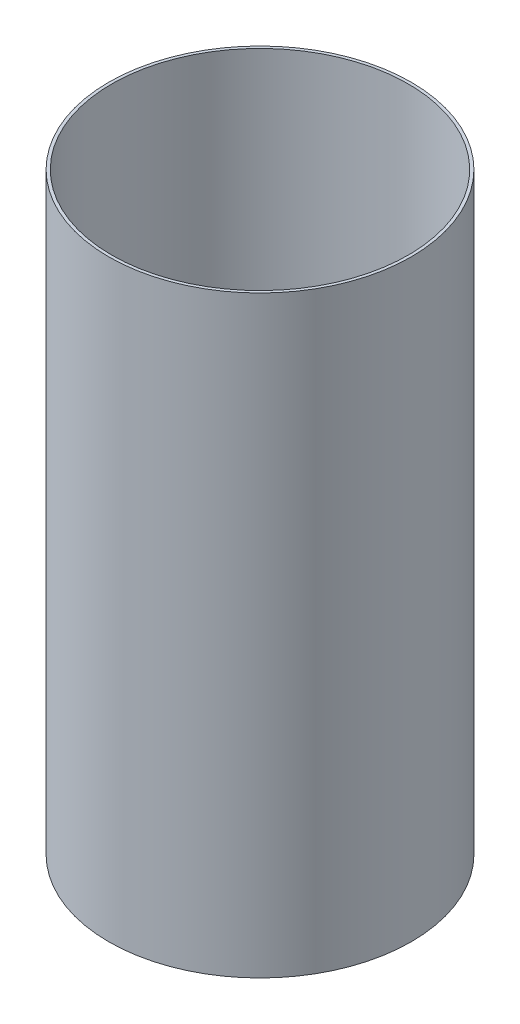
ISO-10303-21;
HEADER;
FILE_DESCRIPTION(('STEP AP214'),'2;1');
FILE_NAME('part.step','',(''),(''),'','','');
FILE_SCHEMA(('AUTOMOTIVE_DESIGN { 1 0 10303 214 1 1 1 1 }'));
ENDSEC;
DATA;
#1=APPLICATION_CONTEXT('core data for automotive mechanical design processes');
#2=APPLICATION_PROTOCOL_DEFINITION('international standard','automotive_design',2000,#1);
#3=PRODUCT_CONTEXT('',#1,'mechanical');
#4=PRODUCT('Part','Part','',(#3));
#5=PRODUCT_RELATED_PRODUCT_CATEGORY('part','',(#4));
#6=PRODUCT_DEFINITION_FORMATION('','',#4);
#7=PRODUCT_DEFINITION_CONTEXT('part definition',#1,'design');
#8=PRODUCT_DEFINITION('design','',#6,#7);
#9=PRODUCT_DEFINITION_SHAPE('','',#8);
#10=(LENGTH_UNIT() NAMED_UNIT(*) SI_UNIT(.MILLI.,.METRE.));
#11=(NAMED_UNIT(*) PLANE_ANGLE_UNIT() SI_UNIT($,.RADIAN.));
#12=(NAMED_UNIT(*) SI_UNIT($,.STERADIAN.) SOLID_ANGLE_UNIT());
#13=UNCERTAINTY_MEASURE_WITH_UNIT(LENGTH_MEASURE(1.E-05),#10,'distance_accuracy_value','');
#14=(GEOMETRIC_REPRESENTATION_CONTEXT(3) GLOBAL_UNCERTAINTY_ASSIGNED_CONTEXT((#13)) GLOBAL_UNIT_ASSIGNED_CONTEXT((#10,
#11,#12)) REPRESENTATION_CONTEXT('',''));
#15=CARTESIAN_POINT('',(0.,0.,0.));
#16=DIRECTION('',(0.,0.,1.));
#17=DIRECTION('',(1.,0.,0.));
#18=AXIS2_PLACEMENT_3D('',#15,#16,#17);
#19=CARTESIAN_POINT('',(0.,200.,0.));
#20=DIRECTION('',(0.,1.,0.));
#21=DIRECTION('',(0.,0.,1.));
#22=AXIS2_PLACEMENT_3D('',#19,#20,#21);
#23=PLANE('',#22);
#24=CARTESIAN_POINT('',(0.,200.,0.));
#25=DIRECTION('',(0.,1.,0.));
#26=DIRECTION('',(0.,0.,1.));
#27=AXIS2_PLACEMENT_3D('',#24,#25,#26);
#28=CIRCLE('',#27,51.);
#29=CARTESIAN_POINT('',(0.,200.,51.));
#30=VERTEX_POINT('',#29);
#31=EDGE_CURVE('E10',#30,#30,#28,.T.);
#32=ORIENTED_EDGE('',*,*,#31,.T.);
#33=EDGE_LOOP('',(#32));
#34=FACE_BOUND('',#33,.T.);
#35=CARTESIAN_POINT('',(0.,200.,0.));
#36=DIRECTION('',(0.,1.,0.));
#37=DIRECTION('',(0.,0.,1.));
#38=AXIS2_PLACEMENT_3D('',#35,#36,#37);
#39=CIRCLE('',#38,50.);
#40=CARTESIAN_POINT('',(0.,200.,50.));
#41=VERTEX_POINT('',#40);
#42=EDGE_CURVE('E54',#41,#41,#39,.T.);
#43=ORIENTED_EDGE('',*,*,#42,.F.);
#44=EDGE_LOOP('',(#43));
#45=FACE_BOUND('',#44,.T.);
#46=ADVANCED_FACE('F41',(#34,#45),#23,.T.);
#47=CARTESIAN_POINT('',(0.,0.,0.));
#48=DIRECTION('',(0.,1.,0.));
#49=DIRECTION('',(0.,0.,1.));
#50=AXIS2_PLACEMENT_3D('',#47,#48,#49);
#51=PLANE('',#50);
#52=CARTESIAN_POINT('',(0.,0.,0.));
#53=DIRECTION('',(0.,1.,0.));
#54=DIRECTION('',(0.,0.,1.));
#55=AXIS2_PLACEMENT_3D('',#52,#53,#54);
#56=CIRCLE('',#55,51.);
#57=CARTESIAN_POINT('',(0.,0.,51.));
#58=VERTEX_POINT('',#57);
#59=EDGE_CURVE('E45',#58,#58,#56,.T.);
#60=ORIENTED_EDGE('',*,*,#59,.F.);
#61=EDGE_LOOP('',(#60));
#62=FACE_BOUND('',#61,.T.);
#63=CARTESIAN_POINT('',(0.,0.,0.));
#64=DIRECTION('',(0.,1.,0.));
#65=DIRECTION('',(0.,0.,1.));
#66=AXIS2_PLACEMENT_3D('',#63,#64,#65);
#67=CIRCLE('',#66,50.);
#68=CARTESIAN_POINT('',(0.,0.,50.));
#69=VERTEX_POINT('',#68);
#70=EDGE_CURVE('E56',#69,#69,#67,.T.);
#71=ORIENTED_EDGE('',*,*,#70,.T.);
#72=EDGE_LOOP('',(#71));
#73=FACE_BOUND('',#72,.T.);
#74=ADVANCED_FACE('F68',(#62,#73),#51,.F.);
#75=CARTESIAN_POINT('',(0.,200.,0.));
#76=DIRECTION('',(0.,-1.,0.));
#77=DIRECTION('',(0.,0.,-1.));
#78=AXIS2_PLACEMENT_3D('',#75,#76,#77);
#79=CYLINDRICAL_SURFACE('',#78,51.);
#80=ORIENTED_EDGE('',*,*,#31,.F.);
#81=EDGE_LOOP('',(#80));
#82=FACE_BOUND('',#81,.T.);
#83=ORIENTED_EDGE('',*,*,#59,.T.);
#84=EDGE_LOOP('',(#83));
#85=FACE_BOUND('',#84,.T.);
#86=ADVANCED_FACE('F43',(#82,#85),#79,.T.);
#87=CARTESIAN_POINT('',(0.,200.,0.));
#88=DIRECTION('',(0.,-1.,0.));
#89=DIRECTION('',(0.,0.,-1.));
#90=AXIS2_PLACEMENT_3D('',#87,#88,#89);
#91=CYLINDRICAL_SURFACE('',#90,50.);
#92=ORIENTED_EDGE('',*,*,#42,.T.);
#93=EDGE_LOOP('',(#92));
#94=FACE_BOUND('',#93,.T.);
#95=ORIENTED_EDGE('',*,*,#70,.F.);
#96=EDGE_LOOP('',(#95));
#97=FACE_BOUND('',#96,.T.);
#98=ADVANCED_FACE('F64',(#94,#97),#91,.F.);
#99=CLOSED_SHELL('',(#46,#74,#86,#98));
#100=MANIFOLD_SOLID_BREP('B2',#99);
#101=ADVANCED_BREP_SHAPE_REPRESENTATION('',(#18,#100),#14);
#102=SHAPE_DEFINITION_REPRESENTATION(#9,#101);
ENDSEC;
END-ISO-10303-21;
